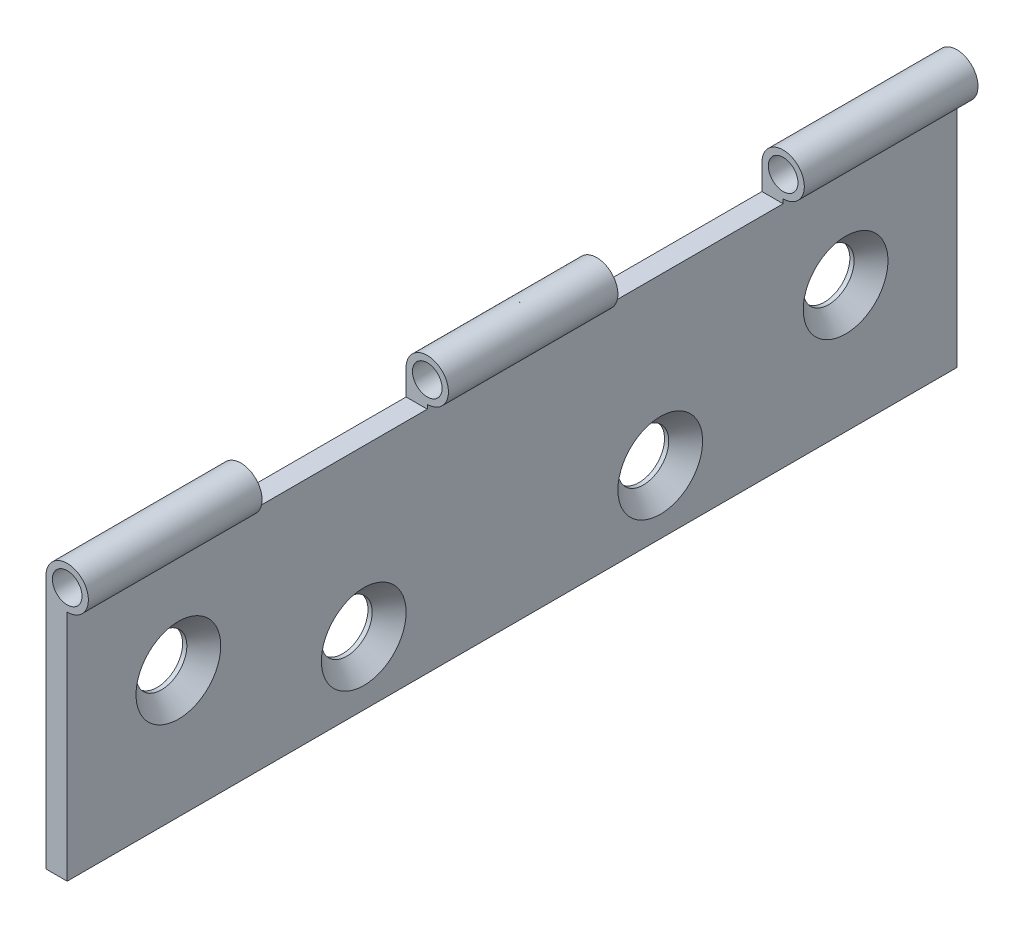
ISO-10303-21;
HEADER;
FILE_DESCRIPTION(('STEP AP214'),'2;1');
FILE_NAME('part.step','',(''),(''),'','','');
FILE_SCHEMA(('AUTOMOTIVE_DESIGN { 1 0 10303 214 1 1 1 1 }'));
ENDSEC;
DATA;
#1=APPLICATION_CONTEXT('core data for automotive mechanical design processes');
#2=APPLICATION_PROTOCOL_DEFINITION('international standard','automotive_design',2000,#1);
#3=PRODUCT_CONTEXT('',#1,'mechanical');
#4=PRODUCT('Part','Part','',(#3));
#5=PRODUCT_RELATED_PRODUCT_CATEGORY('part','',(#4));
#6=PRODUCT_DEFINITION_FORMATION('','',#4);
#7=PRODUCT_DEFINITION_CONTEXT('part definition',#1,'design');
#8=PRODUCT_DEFINITION('design','',#6,#7);
#9=PRODUCT_DEFINITION_SHAPE('','',#8);
#10=(LENGTH_UNIT() NAMED_UNIT(*) SI_UNIT(.MILLI.,.METRE.));
#11=(NAMED_UNIT(*) PLANE_ANGLE_UNIT() SI_UNIT($,.RADIAN.));
#12=(NAMED_UNIT(*) SI_UNIT($,.STERADIAN.) SOLID_ANGLE_UNIT());
#13=UNCERTAINTY_MEASURE_WITH_UNIT(LENGTH_MEASURE(1.E-05),#10,'distance_accuracy_value','');
#14=(GEOMETRIC_REPRESENTATION_CONTEXT(3) GLOBAL_UNCERTAINTY_ASSIGNED_CONTEXT((#13)) GLOBAL_UNIT_ASSIGNED_CONTEXT((#10,
#11,#12)) REPRESENTATION_CONTEXT('',''));
#15=CARTESIAN_POINT('',(0.,0.,0.));
#16=DIRECTION('',(0.,0.,1.));
#17=DIRECTION('',(1.,0.,0.));
#18=AXIS2_PLACEMENT_3D('',#15,#16,#17);
#19=CARTESIAN_POINT('',(5.,60.,105.));
#20=DIRECTION('',(0.,0.,-1.));
#21=DIRECTION('',(-1.,0.,0.));
#22=AXIS2_PLACEMENT_3D('',#19,#20,#21);
#23=CYLINDRICAL_SURFACE('',#22,5.);
#24=DIRECTION('',(0.,0.,-1.));
#25=VECTOR('',#24,1.);
#26=CARTESIAN_POINT('',(0.,60.,105.));
#27=LINE('',#26,#25);
#28=CARTESIAN_POINT('',(0.,60.,-64.));
#29=VERTEX_POINT('',#28);
#30=CARTESIAN_POINT('',(0.,60.,-105.));
#31=VERTEX_POINT('',#30);
#32=EDGE_CURVE('E46',#29,#31,#27,.T.);
#33=ORIENTED_EDGE('',*,*,#32,.F.);
#34=CARTESIAN_POINT('',(5.,60.,-64.));
#35=DIRECTION('',(0.,0.,-1.));
#36=DIRECTION('',(0.,1.,0.));
#37=AXIS2_PLACEMENT_3D('',#34,#35,#36);
#38=CIRCLE('',#37,5.);
#39=CARTESIAN_POINT('',(5.,55.,-64.));
#40=VERTEX_POINT('',#39);
#41=EDGE_CURVE('E199',#29,#40,#38,.T.);
#42=ORIENTED_EDGE('',*,*,#41,.T.);
#43=DIRECTION('',(0.,0.,-1.));
#44=VECTOR('',#43,1.);
#45=CARTESIAN_POINT('',(5.,55.,105.));
#46=LINE('',#45,#44);
#47=CARTESIAN_POINT('',(5.,55.,-105.));
#48=VERTEX_POINT('',#47);
#49=EDGE_CURVE('E260',#40,#48,#46,.T.);
#50=ORIENTED_EDGE('',*,*,#49,.T.);
#51=CARTESIAN_POINT('',(5.,60.,-105.));
#52=DIRECTION('',(0.,0.,1.));
#53=DIRECTION('',(1.,0.,0.));
#54=AXIS2_PLACEMENT_3D('',#51,#52,#53);
#55=CIRCLE('',#54,5.);
#56=CARTESIAN_POINT('',(10.,60.,-105.));
#57=VERTEX_POINT('',#56);
#58=EDGE_CURVE('E256',#48,#57,#55,.T.);
#59=ORIENTED_EDGE('',*,*,#58,.T.);
#60=EDGE_CURVE('E257',#57,#31,#55,.T.);
#61=ORIENTED_EDGE('',*,*,#60,.T.);
#62=EDGE_LOOP('',(#33,#42,#50,#59,#61));
#63=FACE_BOUND('',#62,.T.);
#64=ADVANCED_FACE('F35',(#63),#23,.T.);
#65=CARTESIAN_POINT('',(5.,55.,105.));
#66=VERTEX_POINT('',#65);
#67=CARTESIAN_POINT('',(5.,55.,64.));
#68=VERTEX_POINT('',#67);
#69=EDGE_CURVE('E53',#66,#68,#46,.T.);
#70=ORIENTED_EDGE('',*,*,#69,.T.);
#71=CARTESIAN_POINT('',(5.,60.,64.));
#72=DIRECTION('',(0.,0.,1.));
#73=DIRECTION('',(0.,-1.,0.));
#74=AXIS2_PLACEMENT_3D('',#71,#72,#73);
#75=CIRCLE('',#74,5.);
#76=CARTESIAN_POINT('',(0.,60.,64.));
#77=VERTEX_POINT('',#76);
#78=EDGE_CURVE('E191',#68,#77,#75,.T.);
#79=ORIENTED_EDGE('',*,*,#78,.T.);
#80=CARTESIAN_POINT('',(0.,60.,105.));
#81=VERTEX_POINT('',#80);
#82=EDGE_CURVE('E11',#81,#77,#27,.T.);
#83=ORIENTED_EDGE('',*,*,#82,.F.);
#84=CARTESIAN_POINT('',(5.,60.,105.));
#85=DIRECTION('',(0.,0.,1.));
#86=DIRECTION('',(1.,0.,0.));
#87=AXIS2_PLACEMENT_3D('',#84,#85,#86);
#88=CIRCLE('',#87,5.);
#89=CARTESIAN_POINT('',(10.,60.,105.));
#90=VERTEX_POINT('',#89);
#91=EDGE_CURVE('E253',#90,#81,#88,.T.);
#92=ORIENTED_EDGE('',*,*,#91,.F.);
#93=EDGE_CURVE('E250',#66,#90,#88,.T.);
#94=ORIENTED_EDGE('',*,*,#93,.F.);
#95=EDGE_LOOP('',(#70,#79,#83,#92,#94));
#96=FACE_BOUND('',#95,.T.);
#97=ADVANCED_FACE('F302',(#96),#23,.T.);
#98=CARTESIAN_POINT('',(5.,60.,-105.));
#99=DIRECTION('',(0.,0.,1.));
#100=DIRECTION('',(1.,0.,0.));
#101=AXIS2_PLACEMENT_3D('',#98,#99,#100);
#102=CYLINDRICAL_SURFACE('',#101,3.5);
#103=CARTESIAN_POINT('',(5.,60.,-64.));
#104=DIRECTION('',(0.,0.,-1.));
#105=DIRECTION('',(0.,1.,0.));
#106=AXIS2_PLACEMENT_3D('',#103,#104,#105);
#107=CIRCLE('',#106,3.5);
#108=CARTESIAN_POINT('',(5.,63.5,-64.));
#109=VERTEX_POINT('',#108);
#110=EDGE_CURVE('E39',#109,#109,#107,.F.);
#111=ORIENTED_EDGE('',*,*,#110,.T.);
#112=EDGE_LOOP('',(#111));
#113=FACE_BOUND('',#112,.T.);
#114=CARTESIAN_POINT('',(5.,60.,-105.));
#115=DIRECTION('',(0.,0.,1.));
#116=DIRECTION('',(1.,0.,0.));
#117=AXIS2_PLACEMENT_3D('',#114,#115,#116);
#118=CIRCLE('',#117,3.5);
#119=CARTESIAN_POINT('',(8.5,60.,-105.));
#120=VERTEX_POINT('',#119);
#121=EDGE_CURVE('E247',#120,#120,#118,.T.);
#122=ORIENTED_EDGE('',*,*,#121,.F.);
#123=EDGE_LOOP('',(#122));
#124=FACE_BOUND('',#123,.T.);
#125=ADVANCED_FACE('F296',(#113,#124),#102,.F.);
#126=CARTESIAN_POINT('',(5.,60.,64.));
#127=DIRECTION('',(0.,0.,1.));
#128=DIRECTION('',(0.,-1.,0.));
#129=AXIS2_PLACEMENT_3D('',#126,#127,#128);
#130=CIRCLE('',#129,3.5);
#131=CARTESIAN_POINT('',(5.,56.5,64.));
#132=VERTEX_POINT('',#131);
#133=EDGE_CURVE('E190',#132,#132,#130,.F.);
#134=ORIENTED_EDGE('',*,*,#133,.T.);
#135=EDGE_LOOP('',(#134));
#136=FACE_BOUND('',#135,.T.);
#137=CARTESIAN_POINT('',(5.,60.,105.));
#138=DIRECTION('',(0.,0.,1.));
#139=DIRECTION('',(1.,0.,0.));
#140=AXIS2_PLACEMENT_3D('',#137,#138,#139);
#141=CIRCLE('',#140,3.5);
#142=CARTESIAN_POINT('',(8.5,60.,105.));
#143=VERTEX_POINT('',#142);
#144=EDGE_CURVE('E246',#143,#143,#141,.T.);
#145=ORIENTED_EDGE('',*,*,#144,.T.);
#146=EDGE_LOOP('',(#145));
#147=FACE_BOUND('',#146,.T.);
#148=ADVANCED_FACE('F297',(#136,#147),#102,.F.);
#149=CARTESIAN_POINT('',(5.,0.,105.));
#150=DIRECTION('',(-1.,0.,0.));
#151=DIRECTION('',(0.,0.,1.));
#152=AXIS2_PLACEMENT_3D('',#149,#150,#151);
#153=PLANE('',#152);
#154=CARTESIAN_POINT('',(5.,15.,-35.));
#155=DIRECTION('',(-1.,0.,0.));
#156=DIRECTION('',(0.,0.,1.));
#157=AXIS2_PLACEMENT_3D('',#154,#155,#156);
#158=CIRCLE('',#157,10.);
#159=CARTESIAN_POINT('',(5.,15.,-25.));
#160=VERTEX_POINT('',#159);
#161=EDGE_CURVE('E210',#160,#160,#158,.T.);
#162=ORIENTED_EDGE('',*,*,#161,.T.);
#163=EDGE_LOOP('',(#162));
#164=FACE_BOUND('',#163,.T.);
#165=CARTESIAN_POINT('',(5.,30.,-78.75));
#166=DIRECTION('',(-1.,0.,0.));
#167=DIRECTION('',(0.,0.,1.));
#168=AXIS2_PLACEMENT_3D('',#165,#166,#167);
#169=CIRCLE('',#168,10.);
#170=CARTESIAN_POINT('',(5.,30.,-68.75));
#171=VERTEX_POINT('',#170);
#172=EDGE_CURVE('E219',#171,#171,#169,.T.);
#173=ORIENTED_EDGE('',*,*,#172,.T.);
#174=EDGE_LOOP('',(#173));
#175=FACE_BOUND('',#174,.T.);
#176=CARTESIAN_POINT('',(5.,30.,78.75));
#177=DIRECTION('',(1.,0.,0.));
#178=DIRECTION('',(0.,0.,-1.));
#179=AXIS2_PLACEMENT_3D('',#176,#177,#178);
#180=CIRCLE('',#179,10.);
#181=CARTESIAN_POINT('',(5.,30.,68.75));
#182=VERTEX_POINT('',#181);
#183=EDGE_CURVE('E228',#182,#182,#180,.T.);
#184=ORIENTED_EDGE('',*,*,#183,.F.);
#185=EDGE_LOOP('',(#184));
#186=FACE_BOUND('',#185,.T.);
#187=CARTESIAN_POINT('',(5.,15.,35.));
#188=DIRECTION('',(1.,0.,0.));
#189=DIRECTION('',(0.,0.,-1.));
#190=AXIS2_PLACEMENT_3D('',#187,#188,#189);
#191=CIRCLE('',#190,10.);
#192=CARTESIAN_POINT('',(5.,15.,25.));
#193=VERTEX_POINT('',#192);
#194=EDGE_CURVE('E237',#193,#193,#191,.T.);
#195=ORIENTED_EDGE('',*,*,#194,.F.);
#196=EDGE_LOOP('',(#195));
#197=FACE_BOUND('',#196,.T.);
#198=ORIENTED_EDGE('',*,*,#49,.F.);
#199=DIRECTION('',(0.,-1.,0.));
#200=VECTOR('',#199,1.);
#201=CARTESIAN_POINT('',(5.,4.26426570821935E-13,-64.0000000000002));
#202=LINE('',#201,#200);
#203=CARTESIAN_POINT('',(5.,54.,-64.));
#204=VERTEX_POINT('',#203);
#205=EDGE_CURVE('E202',#40,#204,#202,.T.);
#206=ORIENTED_EDGE('',*,*,#205,.T.);
#207=DIRECTION('',(0.,0.,1.));
#208=VECTOR('',#207,1.);
#209=CARTESIAN_POINT('',(5.,54.,105.));
#210=LINE('',#209,#208);
#211=CARTESIAN_POINT('',(5.,54.,-20.));
#212=VERTEX_POINT('',#211);
#213=EDGE_CURVE('E208',#204,#212,#210,.T.);
#214=ORIENTED_EDGE('',*,*,#213,.T.);
#215=DIRECTION('',(0.,1.,0.));
#216=VECTOR('',#215,1.);
#217=CARTESIAN_POINT('',(5.,0.,-20.));
#218=LINE('',#217,#216);
#219=CARTESIAN_POINT('',(5.,55.,-20.));
#220=VERTEX_POINT('',#219);
#221=EDGE_CURVE('E148',#212,#220,#218,.T.);
#222=ORIENTED_EDGE('',*,*,#221,.T.);
#223=CARTESIAN_POINT('',(5.,55.,20.));
#224=VERTEX_POINT('',#223);
#225=EDGE_CURVE('E263',#224,#220,#46,.T.);
#226=ORIENTED_EDGE('',*,*,#225,.F.);
#227=DIRECTION('',(0.,-1.,0.));
#228=VECTOR('',#227,1.);
#229=CARTESIAN_POINT('',(5.,0.,20.));
#230=LINE('',#229,#228);
#231=CARTESIAN_POINT('',(5.,54.,20.));
#232=VERTEX_POINT('',#231);
#233=EDGE_CURVE('E187',#224,#232,#230,.T.);
#234=ORIENTED_EDGE('',*,*,#233,.T.);
#235=DIRECTION('',(0.,0.,1.));
#236=VECTOR('',#235,1.);
#237=CARTESIAN_POINT('',(5.,54.,105.));
#238=LINE('',#237,#236);
#239=CARTESIAN_POINT('',(5.,54.,64.));
#240=VERTEX_POINT('',#239);
#241=EDGE_CURVE('E205',#232,#240,#238,.T.);
#242=ORIENTED_EDGE('',*,*,#241,.T.);
#243=DIRECTION('',(0.,1.,0.));
#244=VECTOR('',#243,1.);
#245=CARTESIAN_POINT('',(5.,-1.03452600021889E-13,64.0000000000002));
#246=LINE('',#245,#244);
#247=EDGE_CURVE('E193',#240,#68,#246,.T.);
#248=ORIENTED_EDGE('',*,*,#247,.T.);
#249=ORIENTED_EDGE('',*,*,#69,.F.);
#250=DIRECTION('',(0.,1.,0.));
#251=VECTOR('',#250,1.);
#252=CARTESIAN_POINT('',(5.,0.,105.));
#253=LINE('',#252,#251);
#254=CARTESIAN_POINT('',(5.,0.,105.));
#255=VERTEX_POINT('',#254);
#256=EDGE_CURVE('E264',#255,#66,#253,.T.);
#257=ORIENTED_EDGE('',*,*,#256,.F.);
#258=DIRECTION('',(0.,0.,-1.));
#259=VECTOR('',#258,1.);
#260=CARTESIAN_POINT('',(5.,0.,105.));
#261=LINE('',#260,#259);
#262=CARTESIAN_POINT('',(5.,0.,-105.));
#263=VERTEX_POINT('',#262);
#264=EDGE_CURVE('E62',#255,#263,#261,.T.);
#265=ORIENTED_EDGE('',*,*,#264,.T.);
#266=DIRECTION('',(0.,1.,0.));
#267=VECTOR('',#266,1.);
#268=CARTESIAN_POINT('',(5.,0.,-105.));
#269=LINE('',#268,#267);
#270=EDGE_CURVE('E262',#263,#48,#269,.T.);
#271=ORIENTED_EDGE('',*,*,#270,.T.);
#272=EDGE_LOOP('',(#198,#206,#214,#222,#226,#234,#242,#248,#249,#257,#265,#271));
#273=FACE_BOUND('',#272,.T.);
#274=ADVANCED_FACE('F37',(#164,#175,#186,#197,#273),#153,.F.);
#275=CARTESIAN_POINT('',(0.,0.,105.));
#276=DIRECTION('',(-1.,0.,0.));
#277=DIRECTION('',(0.,0.,1.));
#278=AXIS2_PLACEMENT_3D('',#275,#276,#277);
#279=PLANE('',#278);
#280=DIRECTION('',(0.,1.,0.));
#281=VECTOR('',#280,1.);
#282=CARTESIAN_POINT('',(0.,54.,-64.));
#283=LINE('',#282,#281);
#284=CARTESIAN_POINT('',(0.,54.,-64.));
#285=VERTEX_POINT('',#284);
#286=EDGE_CURVE('E164',#285,#29,#283,.T.);
#287=ORIENTED_EDGE('',*,*,#286,.T.);
#288=ORIENTED_EDGE('',*,*,#32,.T.);
#289=DIRECTION('',(0.,1.,0.));
#290=VECTOR('',#289,1.);
#291=CARTESIAN_POINT('',(0.,0.,-105.));
#292=LINE('',#291,#290);
#293=CARTESIAN_POINT('',(0.,0.,-105.));
#294=VERTEX_POINT('',#293);
#295=EDGE_CURVE('E271',#294,#31,#292,.T.);
#296=ORIENTED_EDGE('',*,*,#295,.F.);
#297=DIRECTION('',(0.,0.,-1.));
#298=VECTOR('',#297,1.);
#299=CARTESIAN_POINT('',(0.,0.,105.));
#300=LINE('',#299,#298);
#301=CARTESIAN_POINT('',(0.,0.,105.));
#302=VERTEX_POINT('',#301);
#303=EDGE_CURVE('E277',#302,#294,#300,.T.);
#304=ORIENTED_EDGE('',*,*,#303,.F.);
#305=DIRECTION('',(0.,1.,0.));
#306=VECTOR('',#305,1.);
#307=CARTESIAN_POINT('',(0.,0.,105.));
#308=LINE('',#307,#306);
#309=EDGE_CURVE('E80',#302,#81,#308,.T.);
#310=ORIENTED_EDGE('',*,*,#309,.T.);
#311=ORIENTED_EDGE('',*,*,#82,.T.);
#312=DIRECTION('',(0.,-1.,0.));
#313=VECTOR('',#312,1.);
#314=CARTESIAN_POINT('',(0.,54.,64.));
#315=LINE('',#314,#313);
#316=CARTESIAN_POINT('',(0.,54.,64.));
#317=VERTEX_POINT('',#316);
#318=EDGE_CURVE('E171',#77,#317,#315,.T.);
#319=ORIENTED_EDGE('',*,*,#318,.T.);
#320=DIRECTION('',(0.,0.,-1.));
#321=VECTOR('',#320,1.);
#322=CARTESIAN_POINT('',(0.,54.,64.));
#323=LINE('',#322,#321);
#324=CARTESIAN_POINT('',(0.,54.,20.));
#325=VERTEX_POINT('',#324);
#326=EDGE_CURVE('E174',#317,#325,#323,.T.);
#327=ORIENTED_EDGE('',*,*,#326,.T.);
#328=DIRECTION('',(0.,1.,0.));
#329=VECTOR('',#328,1.);
#330=CARTESIAN_POINT('',(0.,54.,20.));
#331=LINE('',#330,#329);
#332=CARTESIAN_POINT('',(0.,60.,20.));
#333=VERTEX_POINT('',#332);
#334=EDGE_CURVE('E177',#325,#333,#331,.T.);
#335=ORIENTED_EDGE('',*,*,#334,.T.);
#336=CARTESIAN_POINT('',(0.,60.,-20.));
#337=VERTEX_POINT('',#336);
#338=EDGE_CURVE('E44',#333,#337,#27,.T.);
#339=ORIENTED_EDGE('',*,*,#338,.T.);
#340=DIRECTION('',(0.,-1.,0.));
#341=VECTOR('',#340,1.);
#342=CARTESIAN_POINT('',(0.,54.,-20.));
#343=LINE('',#342,#341);
#344=CARTESIAN_POINT('',(0.,54.,-20.));
#345=VERTEX_POINT('',#344);
#346=EDGE_CURVE('E145',#337,#345,#343,.T.);
#347=ORIENTED_EDGE('',*,*,#346,.T.);
#348=DIRECTION('',(0.,0.,-1.));
#349=VECTOR('',#348,1.);
#350=CARTESIAN_POINT('',(0.,54.,-20.));
#351=LINE('',#350,#349);
#352=EDGE_CURVE('E152',#345,#285,#351,.T.);
#353=ORIENTED_EDGE('',*,*,#352,.T.);
#354=EDGE_LOOP('',(#287,#288,#296,#304,#310,#311,#319,#327,#335,#339,#347,#353));
#355=FACE_BOUND('',#354,.T.);
#356=CARTESIAN_POINT('',(0.,15.,-35.));
#357=DIRECTION('',(-1.,0.,0.));
#358=DIRECTION('',(0.,0.,1.));
#359=AXIS2_PLACEMENT_3D('',#356,#357,#358);
#360=CIRCLE('',#359,6.);
#361=CARTESIAN_POINT('',(0.,15.,-29.));
#362=VERTEX_POINT('',#361);
#363=EDGE_CURVE('E213',#362,#362,#360,.T.);
#364=ORIENTED_EDGE('',*,*,#363,.F.);
#365=EDGE_LOOP('',(#364));
#366=FACE_BOUND('',#365,.T.);
#367=CARTESIAN_POINT('',(0.,30.,-78.75));
#368=DIRECTION('',(-1.,0.,0.));
#369=DIRECTION('',(0.,0.,1.));
#370=AXIS2_PLACEMENT_3D('',#367,#368,#369);
#371=CIRCLE('',#370,6.);
#372=CARTESIAN_POINT('',(0.,30.,-72.75));
#373=VERTEX_POINT('',#372);
#374=EDGE_CURVE('E222',#373,#373,#371,.T.);
#375=ORIENTED_EDGE('',*,*,#374,.F.);
#376=EDGE_LOOP('',(#375));
#377=FACE_BOUND('',#376,.T.);
#378=CARTESIAN_POINT('',(0.,30.,78.75));
#379=DIRECTION('',(1.,0.,0.));
#380=DIRECTION('',(0.,0.,-1.));
#381=AXIS2_PLACEMENT_3D('',#378,#379,#380);
#382=CIRCLE('',#381,6.);
#383=CARTESIAN_POINT('',(0.,30.,72.75));
#384=VERTEX_POINT('',#383);
#385=EDGE_CURVE('E234',#384,#384,#382,.T.);
#386=ORIENTED_EDGE('',*,*,#385,.T.);
#387=EDGE_LOOP('',(#386));
#388=FACE_BOUND('',#387,.T.);
#389=CARTESIAN_POINT('',(0.,15.,35.));
#390=DIRECTION('',(1.,0.,0.));
#391=DIRECTION('',(0.,0.,-1.));
#392=AXIS2_PLACEMENT_3D('',#389,#390,#391);
#393=CIRCLE('',#392,6.);
#394=CARTESIAN_POINT('',(0.,15.,29.));
#395=VERTEX_POINT('',#394);
#396=EDGE_CURVE('E243',#395,#395,#393,.T.);
#397=ORIENTED_EDGE('',*,*,#396,.T.);
#398=EDGE_LOOP('',(#397));
#399=FACE_BOUND('',#398,.T.);
#400=ADVANCED_FACE('F160',(#355,#366,#377,#388,#399),#279,.T.);
#401=CARTESIAN_POINT('',(5.,0.,105.));
#402=DIRECTION('',(0.,-1.,0.));
#403=DIRECTION('',(0.,0.,-1.));
#404=AXIS2_PLACEMENT_3D('',#401,#402,#403);
#405=PLANE('',#404);
#406=DIRECTION('',(-1.,0.,0.));
#407=VECTOR('',#406,1.);
#408=CARTESIAN_POINT('',(5.,0.,-105.));
#409=LINE('',#408,#407);
#410=EDGE_CURVE('E266',#263,#294,#409,.T.);
#411=ORIENTED_EDGE('',*,*,#410,.F.);
#412=ORIENTED_EDGE('',*,*,#264,.F.);
#413=DIRECTION('',(-1.,0.,0.));
#414=VECTOR('',#413,1.);
#415=CARTESIAN_POINT('',(5.,0.,105.));
#416=LINE('',#415,#414);
#417=EDGE_CURVE('E268',#255,#302,#416,.T.);
#418=ORIENTED_EDGE('',*,*,#417,.T.);
#419=ORIENTED_EDGE('',*,*,#303,.T.);
#420=EDGE_LOOP('',(#411,#412,#418,#419));
#421=FACE_BOUND('',#420,.T.);
#422=ADVANCED_FACE('F334',(#421),#405,.T.);
#423=CARTESIAN_POINT('',(0.,0.,105.));
#424=DIRECTION('',(0.,0.,-1.));
#425=DIRECTION('',(-1.,0.,0.));
#426=AXIS2_PLACEMENT_3D('',#423,#424,#425);
#427=PLANE('',#426);
#428=ORIENTED_EDGE('',*,*,#144,.F.);
#429=EDGE_LOOP('',(#428));
#430=FACE_BOUND('',#429,.T.);
#431=ORIENTED_EDGE('',*,*,#256,.T.);
#432=ORIENTED_EDGE('',*,*,#93,.T.);
#433=ORIENTED_EDGE('',*,*,#91,.T.);
#434=ORIENTED_EDGE('',*,*,#309,.F.);
#435=ORIENTED_EDGE('',*,*,#417,.F.);
#436=EDGE_LOOP('',(#431,#432,#433,#434,#435));
#437=FACE_BOUND('',#436,.T.);
#438=ADVANCED_FACE('F323',(#430,#437),#427,.F.);
#439=CARTESIAN_POINT('',(0.,0.,-105.));
#440=DIRECTION('',(0.,0.,-1.));
#441=DIRECTION('',(-1.,0.,0.));
#442=AXIS2_PLACEMENT_3D('',#439,#440,#441);
#443=PLANE('',#442);
#444=ORIENTED_EDGE('',*,*,#121,.T.);
#445=EDGE_LOOP('',(#444));
#446=FACE_BOUND('',#445,.T.);
#447=ORIENTED_EDGE('',*,*,#295,.T.);
#448=ORIENTED_EDGE('',*,*,#60,.F.);
#449=ORIENTED_EDGE('',*,*,#58,.F.);
#450=ORIENTED_EDGE('',*,*,#270,.F.);
#451=ORIENTED_EDGE('',*,*,#410,.T.);
#452=EDGE_LOOP('',(#447,#448,#449,#450,#451));
#453=FACE_BOUND('',#452,.T.);
#454=ADVANCED_FACE('F314',(#446,#453),#443,.T.);
#455=ORIENTED_EDGE('',*,*,#225,.T.);
#456=CARTESIAN_POINT('',(5.,60.,-20.));
#457=DIRECTION('',(0.,0.,1.));
#458=DIRECTION('',(0.,-1.,0.));
#459=AXIS2_PLACEMENT_3D('',#456,#457,#458);
#460=CIRCLE('',#459,5.);
#461=EDGE_CURVE('E196',#220,#337,#460,.T.);
#462=ORIENTED_EDGE('',*,*,#461,.T.);
#463=ORIENTED_EDGE('',*,*,#338,.F.);
#464=CARTESIAN_POINT('',(5.,60.,20.));
#465=DIRECTION('',(0.,0.,-1.));
#466=DIRECTION('',(0.,1.,0.));
#467=AXIS2_PLACEMENT_3D('',#464,#465,#466);
#468=CIRCLE('',#467,5.);
#469=EDGE_CURVE('E184',#333,#224,#468,.T.);
#470=ORIENTED_EDGE('',*,*,#469,.T.);
#471=EDGE_LOOP('',(#455,#462,#463,#470));
#472=FACE_BOUND('',#471,.T.);
#473=ADVANCED_FACE('F305',(#472),#23,.T.);
#474=CARTESIAN_POINT('',(5.,15.,35.));
#475=DIRECTION('',(1.,0.,0.));
#476=DIRECTION('',(0.,0.,-1.));
#477=AXIS2_PLACEMENT_3D('',#474,#475,#476);
#478=CYLINDRICAL_SURFACE('',#477,6.);
#479=ORIENTED_EDGE('',*,*,#396,.F.);
#480=EDGE_LOOP('',(#479));
#481=FACE_BOUND('',#480,.T.);
#482=CARTESIAN_POINT('',(1.,15.,35.));
#483=DIRECTION('',(1.,0.,0.));
#484=DIRECTION('',(0.,0.,-1.));
#485=AXIS2_PLACEMENT_3D('',#482,#483,#484);
#486=CIRCLE('',#485,6.);
#487=CARTESIAN_POINT('',(1.,15.,29.));
#488=VERTEX_POINT('',#487);
#489=EDGE_CURVE('E240',#488,#488,#486,.T.);
#490=ORIENTED_EDGE('',*,*,#489,.T.);
#491=EDGE_LOOP('',(#490));
#492=FACE_BOUND('',#491,.T.);
#493=ADVANCED_FACE('F313',(#481,#492),#478,.F.);
#494=CARTESIAN_POINT('',(5.,15.,35.));
#495=DIRECTION('',(1.,0.,0.));
#496=DIRECTION('',(0.,0.,-1.));
#497=AXIS2_PLACEMENT_3D('',#494,#495,#496);
#498=CONICAL_SURFACE('',#497,10.,0.785398163397449);
#499=ORIENTED_EDGE('',*,*,#489,.F.);
#500=EDGE_LOOP('',(#499));
#501=FACE_BOUND('',#500,.T.);
#502=ORIENTED_EDGE('',*,*,#194,.T.);
#503=EDGE_LOOP('',(#502));
#504=FACE_BOUND('',#503,.T.);
#505=ADVANCED_FACE('F320',(#501,#504),#498,.F.);
#506=CARTESIAN_POINT('',(5.,30.,78.75));
#507=DIRECTION('',(1.,0.,0.));
#508=DIRECTION('',(0.,0.,-1.));
#509=AXIS2_PLACEMENT_3D('',#506,#507,#508);
#510=CYLINDRICAL_SURFACE('',#509,6.);
#511=ORIENTED_EDGE('',*,*,#385,.F.);
#512=EDGE_LOOP('',(#511));
#513=FACE_BOUND('',#512,.T.);
#514=CARTESIAN_POINT('',(1.,30.,78.75));
#515=DIRECTION('',(1.,0.,0.));
#516=DIRECTION('',(0.,0.,-1.));
#517=AXIS2_PLACEMENT_3D('',#514,#515,#516);
#518=CIRCLE('',#517,6.);
#519=CARTESIAN_POINT('',(1.,30.,72.75));
#520=VERTEX_POINT('',#519);
#521=EDGE_CURVE('E231',#520,#520,#518,.T.);
#522=ORIENTED_EDGE('',*,*,#521,.T.);
#523=EDGE_LOOP('',(#522));
#524=FACE_BOUND('',#523,.T.);
#525=ADVANCED_FACE('F380',(#513,#524),#510,.F.);
#526=CARTESIAN_POINT('',(5.,30.,78.75));
#527=DIRECTION('',(1.,0.,0.));
#528=DIRECTION('',(0.,0.,-1.));
#529=AXIS2_PLACEMENT_3D('',#526,#527,#528);
#530=CONICAL_SURFACE('',#529,10.,0.785398163397449);
#531=ORIENTED_EDGE('',*,*,#521,.F.);
#532=EDGE_LOOP('',(#531));
#533=FACE_BOUND('',#532,.T.);
#534=ORIENTED_EDGE('',*,*,#183,.T.);
#535=EDGE_LOOP('',(#534));
#536=FACE_BOUND('',#535,.T.);
#537=ADVANCED_FACE('F376',(#533,#536),#530,.F.);
#538=CARTESIAN_POINT('',(5.,30.,-78.75));
#539=DIRECTION('',(1.,0.,0.));
#540=DIRECTION('',(0.,0.,1.));
#541=AXIS2_PLACEMENT_3D('',#538,#539,#540);
#542=CYLINDRICAL_SURFACE('',#541,6.);
#543=ORIENTED_EDGE('',*,*,#374,.T.);
#544=EDGE_LOOP('',(#543));
#545=FACE_BOUND('',#544,.T.);
#546=CARTESIAN_POINT('',(1.,30.,-78.75));
#547=DIRECTION('',(-1.,0.,0.));
#548=DIRECTION('',(0.,0.,1.));
#549=AXIS2_PLACEMENT_3D('',#546,#547,#548);
#550=CIRCLE('',#549,6.);
#551=CARTESIAN_POINT('',(1.,30.,-72.75));
#552=VERTEX_POINT('',#551);
#553=EDGE_CURVE('E225',#552,#552,#550,.T.);
#554=ORIENTED_EDGE('',*,*,#553,.F.);
#555=EDGE_LOOP('',(#554));
#556=FACE_BOUND('',#555,.T.);
#557=ADVANCED_FACE('F372',(#545,#556),#542,.F.);
#558=CARTESIAN_POINT('',(5.,30.,-78.75));
#559=DIRECTION('',(1.,0.,0.));
#560=DIRECTION('',(0.,0.,1.));
#561=AXIS2_PLACEMENT_3D('',#558,#559,#560);
#562=CONICAL_SURFACE('',#561,10.,0.785398163397449);
#563=ORIENTED_EDGE('',*,*,#553,.T.);
#564=EDGE_LOOP('',(#563));
#565=FACE_BOUND('',#564,.T.);
#566=ORIENTED_EDGE('',*,*,#172,.F.);
#567=EDGE_LOOP('',(#566));
#568=FACE_BOUND('',#567,.T.);
#569=ADVANCED_FACE('F368',(#565,#568),#562,.F.);
#570=CARTESIAN_POINT('',(5.,15.,-35.));
#571=DIRECTION('',(1.,0.,0.));
#572=DIRECTION('',(0.,0.,1.));
#573=AXIS2_PLACEMENT_3D('',#570,#571,#572);
#574=CYLINDRICAL_SURFACE('',#573,6.);
#575=ORIENTED_EDGE('',*,*,#363,.T.);
#576=EDGE_LOOP('',(#575));
#577=FACE_BOUND('',#576,.T.);
#578=CARTESIAN_POINT('',(1.,15.,-35.));
#579=DIRECTION('',(-1.,0.,0.));
#580=DIRECTION('',(0.,0.,1.));
#581=AXIS2_PLACEMENT_3D('',#578,#579,#580);
#582=CIRCLE('',#581,6.);
#583=CARTESIAN_POINT('',(1.,15.,-29.));
#584=VERTEX_POINT('',#583);
#585=EDGE_CURVE('E216',#584,#584,#582,.T.);
#586=ORIENTED_EDGE('',*,*,#585,.F.);
#587=EDGE_LOOP('',(#586));
#588=FACE_BOUND('',#587,.T.);
#589=ADVANCED_FACE('F364',(#577,#588),#574,.F.);
#590=CARTESIAN_POINT('',(5.,15.,-35.));
#591=DIRECTION('',(1.,0.,0.));
#592=DIRECTION('',(0.,0.,1.));
#593=AXIS2_PLACEMENT_3D('',#590,#591,#592);
#594=CONICAL_SURFACE('',#593,10.,0.785398163397449);
#595=ORIENTED_EDGE('',*,*,#585,.T.);
#596=EDGE_LOOP('',(#595));
#597=FACE_BOUND('',#596,.T.);
#598=ORIENTED_EDGE('',*,*,#161,.F.);
#599=EDGE_LOOP('',(#598));
#600=FACE_BOUND('',#599,.T.);
#601=ADVANCED_FACE('F360',(#597,#600),#594,.F.);
#602=CARTESIAN_POINT('',(0.,54.,64.));
#603=DIRECTION('',(0.,-1.,0.));
#604=DIRECTION('',(0.,0.,-1.));
#605=AXIS2_PLACEMENT_3D('',#602,#603,#604);
#606=PLANE('',#605);
#607=DIRECTION('',(1.,0.,0.));
#608=VECTOR('',#607,1.);
#609=CARTESIAN_POINT('',(0.,54.,20.));
#610=LINE('',#609,#608);
#611=EDGE_CURVE('E166',#325,#232,#610,.T.);
#612=ORIENTED_EDGE('',*,*,#611,.F.);
#613=ORIENTED_EDGE('',*,*,#326,.F.);
#614=DIRECTION('',(1.,0.,0.));
#615=VECTOR('',#614,1.);
#616=CARTESIAN_POINT('',(0.,54.,64.));
#617=LINE('',#616,#615);
#618=EDGE_CURVE('E179',#317,#240,#617,.T.);
#619=ORIENTED_EDGE('',*,*,#618,.T.);
#620=ORIENTED_EDGE('',*,*,#241,.F.);
#621=EDGE_LOOP('',(#612,#613,#619,#620));
#622=FACE_BOUND('',#621,.T.);
#623=ADVANCED_FACE('F344',(#622),#606,.F.);
#624=CARTESIAN_POINT('',(0.,54.,64.));
#625=DIRECTION('',(0.,0.,1.));
#626=DIRECTION('',(0.,-1.,0.));
#627=AXIS2_PLACEMENT_3D('',#624,#625,#626);
#628=PLANE('',#627);
#629=ORIENTED_EDGE('',*,*,#133,.F.);
#630=EDGE_LOOP('',(#629));
#631=FACE_BOUND('',#630,.T.);
#632=ORIENTED_EDGE('',*,*,#78,.F.);
#633=ORIENTED_EDGE('',*,*,#247,.F.);
#634=ORIENTED_EDGE('',*,*,#618,.F.);
#635=ORIENTED_EDGE('',*,*,#318,.F.);
#636=EDGE_LOOP('',(#632,#633,#634,#635));
#637=FACE_BOUND('',#636,.T.);
#638=ADVANCED_FACE('F342',(#631,#637),#628,.F.);
#639=CARTESIAN_POINT('',(0.,54.,20.));
#640=DIRECTION('',(0.,0.,-1.));
#641=DIRECTION('',(0.,1.,0.));
#642=AXIS2_PLACEMENT_3D('',#639,#640,#641);
#643=PLANE('',#642);
#644=CARTESIAN_POINT('',(5.,60.,20.));
#645=DIRECTION('',(0.,0.,-1.));
#646=DIRECTION('',(0.,1.,0.));
#647=AXIS2_PLACEMENT_3D('',#644,#645,#646);
#648=CIRCLE('',#647,3.5);
#649=CARTESIAN_POINT('',(5.,63.5,20.));
#650=VERTEX_POINT('',#649);
#651=EDGE_CURVE('E169',#650,#650,#648,.F.);
#652=ORIENTED_EDGE('',*,*,#651,.F.);
#653=EDGE_LOOP('',(#652));
#654=FACE_BOUND('',#653,.T.);
#655=ORIENTED_EDGE('',*,*,#469,.F.);
#656=ORIENTED_EDGE('',*,*,#334,.F.);
#657=ORIENTED_EDGE('',*,*,#611,.T.);
#658=ORIENTED_EDGE('',*,*,#233,.F.);
#659=EDGE_LOOP('',(#655,#656,#657,#658));
#660=FACE_BOUND('',#659,.T.);
#661=ADVANCED_FACE('F347',(#654,#660),#643,.F.);
#662=CARTESIAN_POINT('',(0.,54.,-20.));
#663=DIRECTION('',(0.,-1.,0.));
#664=DIRECTION('',(0.,0.,-1.));
#665=AXIS2_PLACEMENT_3D('',#662,#663,#664);
#666=PLANE('',#665);
#667=DIRECTION('',(1.,0.,0.));
#668=VECTOR('',#667,1.);
#669=CARTESIAN_POINT('',(0.,54.,-64.));
#670=LINE('',#669,#668);
#671=EDGE_CURVE('E151',#285,#204,#670,.T.);
#672=ORIENTED_EDGE('',*,*,#671,.F.);
#673=ORIENTED_EDGE('',*,*,#352,.F.);
#674=DIRECTION('',(1.,0.,0.));
#675=VECTOR('',#674,1.);
#676=CARTESIAN_POINT('',(0.,54.,-20.));
#677=LINE('',#676,#675);
#678=EDGE_CURVE('E141',#345,#212,#677,.T.);
#679=ORIENTED_EDGE('',*,*,#678,.T.);
#680=ORIENTED_EDGE('',*,*,#213,.F.);
#681=EDGE_LOOP('',(#672,#673,#679,#680));
#682=FACE_BOUND('',#681,.T.);
#683=ADVANCED_FACE('F155',(#682),#666,.F.);
#684=CARTESIAN_POINT('',(0.,54.,-64.));
#685=DIRECTION('',(0.,0.,-1.));
#686=DIRECTION('',(0.,1.,0.));
#687=AXIS2_PLACEMENT_3D('',#684,#685,#686);
#688=PLANE('',#687);
#689=ORIENTED_EDGE('',*,*,#110,.F.);
#690=EDGE_LOOP('',(#689));
#691=FACE_BOUND('',#690,.T.);
#692=ORIENTED_EDGE('',*,*,#41,.F.);
#693=ORIENTED_EDGE('',*,*,#286,.F.);
#694=ORIENTED_EDGE('',*,*,#671,.T.);
#695=ORIENTED_EDGE('',*,*,#205,.F.);
#696=EDGE_LOOP('',(#692,#693,#694,#695));
#697=FACE_BOUND('',#696,.T.);
#698=ADVANCED_FACE('F289',(#691,#697),#688,.F.);
#699=CARTESIAN_POINT('',(0.,54.,-20.));
#700=DIRECTION('',(0.,0.,1.));
#701=DIRECTION('',(0.,-1.,0.));
#702=AXIS2_PLACEMENT_3D('',#699,#700,#701);
#703=PLANE('',#702);
#704=CARTESIAN_POINT('',(5.,60.,-20.));
#705=DIRECTION('',(0.,0.,1.));
#706=DIRECTION('',(0.,-1.,0.));
#707=AXIS2_PLACEMENT_3D('',#704,#705,#706);
#708=CIRCLE('',#707,3.5);
#709=CARTESIAN_POINT('',(5.,56.5,-20.));
#710=VERTEX_POINT('',#709);
#711=EDGE_CURVE('E195',#710,#710,#708,.F.);
#712=ORIENTED_EDGE('',*,*,#711,.F.);
#713=EDGE_LOOP('',(#712));
#714=FACE_BOUND('',#713,.T.);
#715=ORIENTED_EDGE('',*,*,#461,.F.);
#716=ORIENTED_EDGE('',*,*,#221,.F.);
#717=ORIENTED_EDGE('',*,*,#678,.F.);
#718=ORIENTED_EDGE('',*,*,#346,.F.);
#719=EDGE_LOOP('',(#715,#716,#717,#718));
#720=FACE_BOUND('',#719,.T.);
#721=ADVANCED_FACE('F143',(#714,#720),#703,.F.);
#722=ORIENTED_EDGE('',*,*,#711,.T.);
#723=EDGE_LOOP('',(#722));
#724=FACE_BOUND('',#723,.T.);
#725=ORIENTED_EDGE('',*,*,#651,.T.);
#726=EDGE_LOOP('',(#725));
#727=FACE_BOUND('',#726,.T.);
#728=ADVANCED_FACE('F285',(#724,#727),#102,.F.);
#729=CLOSED_SHELL('',(#64,#97,#125,#148,#274,#400,#422,#438,#454,#473,#493,#505,#525,#537,#557,
#569,#589,#601,#623,#638,#661,#683,#698,#721,#728));
#730=MANIFOLD_SOLID_BREP('B2',#729);
#731=ADVANCED_BREP_SHAPE_REPRESENTATION('',(#18,#730),#14);
#732=SHAPE_DEFINITION_REPRESENTATION(#9,#731);
ENDSEC;
END-ISO-10303-21;
